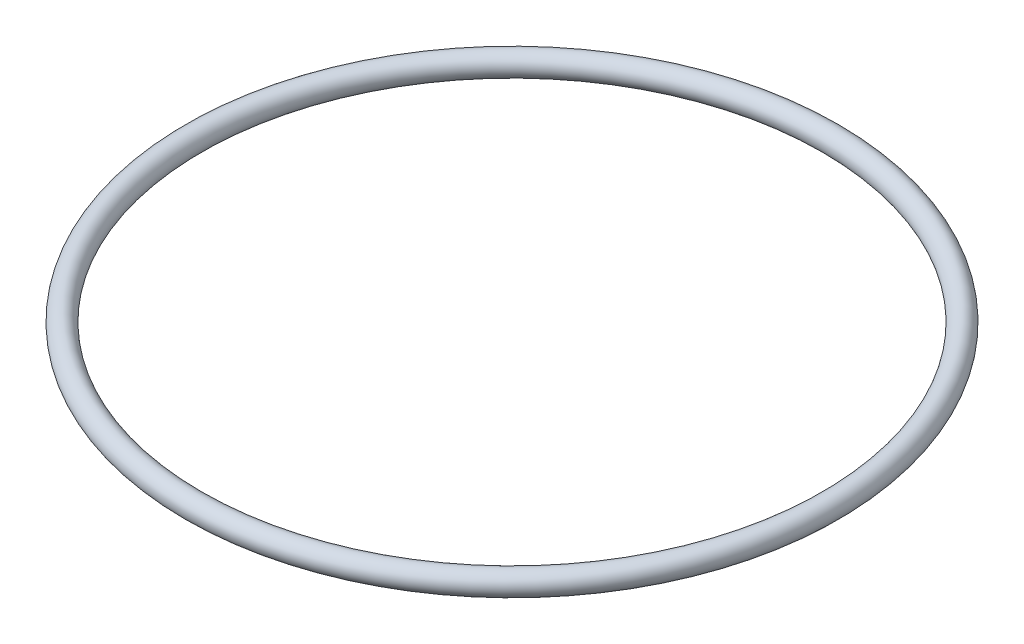
ISO-10303-21;
HEADER;
FILE_DESCRIPTION(('STEP AP214'),'2;1');
FILE_NAME('part.step','',(''),(''),'','','');
FILE_SCHEMA(('AUTOMOTIVE_DESIGN { 1 0 10303 214 1 1 1 1 }'));
ENDSEC;
DATA;
#1=APPLICATION_CONTEXT('core data for automotive mechanical design processes');
#2=APPLICATION_PROTOCOL_DEFINITION('international standard','automotive_design',2000,#1);
#3=PRODUCT_CONTEXT('',#1,'mechanical');
#4=PRODUCT('Part','Part','',(#3));
#5=PRODUCT_RELATED_PRODUCT_CATEGORY('part','',(#4));
#6=PRODUCT_DEFINITION_FORMATION('','',#4);
#7=PRODUCT_DEFINITION_CONTEXT('part definition',#1,'design');
#8=PRODUCT_DEFINITION('design','',#6,#7);
#9=PRODUCT_DEFINITION_SHAPE('','',#8);
#10=(LENGTH_UNIT() NAMED_UNIT(*) SI_UNIT(.MILLI.,.METRE.));
#11=(NAMED_UNIT(*) PLANE_ANGLE_UNIT() SI_UNIT($,.RADIAN.));
#12=(NAMED_UNIT(*) SI_UNIT($,.STERADIAN.) SOLID_ANGLE_UNIT());
#13=UNCERTAINTY_MEASURE_WITH_UNIT(LENGTH_MEASURE(1.E-05),#10,'distance_accuracy_value','');
#14=(GEOMETRIC_REPRESENTATION_CONTEXT(3) GLOBAL_UNCERTAINTY_ASSIGNED_CONTEXT((#13)) GLOBAL_UNIT_ASSIGNED_CONTEXT((#10,
#11,#12)) REPRESENTATION_CONTEXT('',''));
#15=CARTESIAN_POINT('',(0.,0.,0.));
#16=DIRECTION('',(0.,0.,1.));
#17=DIRECTION('',(1.,0.,0.));
#18=AXIS2_PLACEMENT_3D('',#15,#16,#17);
#19=CARTESIAN_POINT('',(0.,0.,0.));
#20=DIRECTION('',(0.,1.,0.));
#21=DIRECTION('',(0.,0.,1.));
#22=AXIS2_PLACEMENT_3D('',#19,#20,#21);
#23=TOROIDAL_SURFACE('',#22,33.8,1.2);
#24=CARTESIAN_POINT('',(0.,0.,33.8));
#25=DIRECTION('',(1.,0.,0.));
#26=DIRECTION('',(0.,0.,-1.));
#27=AXIS2_PLACEMENT_3D('',#24,#25,#26);
#28=CIRCLE('',#27,1.2);
#29=CARTESIAN_POINT('',(0.,0.,35.));
#30=VERTEX_POINT('',#29);
#31=EDGE_CURVE('E11',#30,#30,#28,.T.);
#32=CARTESIAN_POINT('',(0.,0.,0.));
#33=DIRECTION('',(0.,1.,0.));
#34=DIRECTION('',(0.,0.,1.));
#35=AXIS2_PLACEMENT_3D('',#32,#33,#34);
#36=CIRCLE('',#35,35.);
#37=EDGE_CURVE('',#30,#30,#36,.T.);
#38=ORIENTED_EDGE('',*,*,#31,.T.);
#39=ORIENTED_EDGE('',*,*,#31,.F.);
#40=ORIENTED_EDGE('',*,*,#37,.T.);
#41=ORIENTED_EDGE('',*,*,#37,.F.);
#42=EDGE_LOOP('',(#38,#40,#39,#41));
#43=FACE_BOUND('',#42,.T.);
#44=ADVANCED_FACE('F43',(#43),#23,.T.);
#45=CLOSED_SHELL('',(#44));
#46=MANIFOLD_SOLID_BREP('B2',#45);
#47=ADVANCED_BREP_SHAPE_REPRESENTATION('',(#18,#46),#14);
#48=SHAPE_DEFINITION_REPRESENTATION(#9,#47);
ENDSEC;
END-ISO-10303-21;
